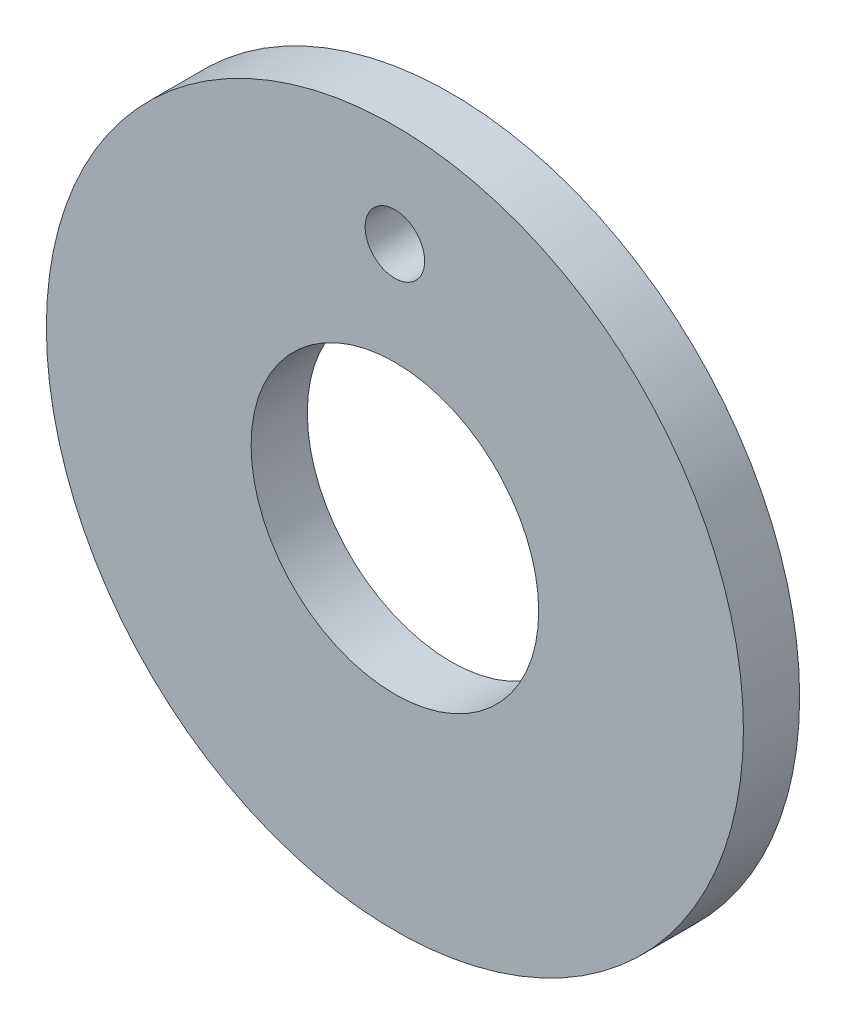
ISO-10303-21;
HEADER;
FILE_DESCRIPTION(('STEP AP214'),'2;1');
FILE_NAME('part.step','',(''),(''),'','','');
FILE_SCHEMA(('AUTOMOTIVE_DESIGN { 1 0 10303 214 1 1 1 1 }'));
ENDSEC;
DATA;
#1=APPLICATION_CONTEXT('core data for automotive mechanical design processes');
#2=APPLICATION_PROTOCOL_DEFINITION('international standard','automotive_design',2000,#1);
#3=PRODUCT_CONTEXT('',#1,'mechanical');
#4=PRODUCT('Part','Part','',(#3));
#5=PRODUCT_RELATED_PRODUCT_CATEGORY('part','',(#4));
#6=PRODUCT_DEFINITION_FORMATION('','',#4);
#7=PRODUCT_DEFINITION_CONTEXT('part definition',#1,'design');
#8=PRODUCT_DEFINITION('design','',#6,#7);
#9=PRODUCT_DEFINITION_SHAPE('','',#8);
#10=(LENGTH_UNIT() NAMED_UNIT(*) SI_UNIT(.MILLI.,.METRE.));
#11=(NAMED_UNIT(*) PLANE_ANGLE_UNIT() SI_UNIT($,.RADIAN.));
#12=(NAMED_UNIT(*) SI_UNIT($,.STERADIAN.) SOLID_ANGLE_UNIT());
#13=UNCERTAINTY_MEASURE_WITH_UNIT(LENGTH_MEASURE(1.E-05),#10,'distance_accuracy_value','');
#14=(GEOMETRIC_REPRESENTATION_CONTEXT(3) GLOBAL_UNCERTAINTY_ASSIGNED_CONTEXT((#13)) GLOBAL_UNIT_ASSIGNED_CONTEXT((#10,
#11,#12)) REPRESENTATION_CONTEXT('',''));
#15=CARTESIAN_POINT('',(0.,0.,0.));
#16=DIRECTION('',(0.,0.,1.));
#17=DIRECTION('',(1.,0.,0.));
#18=AXIS2_PLACEMENT_3D('',#15,#16,#17);
#19=CARTESIAN_POINT('',(0.,0.,6.));
#20=DIRECTION('',(0.,0.,1.));
#21=DIRECTION('',(1.,0.,0.));
#22=AXIS2_PLACEMENT_3D('',#19,#20,#21);
#23=PLANE('',#22);
#24=CARTESIAN_POINT('',(0.,26.275,6.));
#25=DIRECTION('',(0.,0.,1.));
#26=DIRECTION('',(1.,0.,0.));
#27=AXIS2_PLACEMENT_3D('',#24,#25,#26);
#28=CIRCLE('',#27,3.175);
#29=CARTESIAN_POINT('',(3.175,26.275,6.));
#30=VERTEX_POINT('',#29);
#31=EDGE_CURVE('E65',#30,#30,#28,.T.);
#32=ORIENTED_EDGE('',*,*,#31,.F.);
#33=EDGE_LOOP('',(#32));
#34=FACE_BOUND('',#33,.T.);
#35=CARTESIAN_POINT('',(0.,0.,6.));
#36=DIRECTION('',(0.,0.,1.));
#37=DIRECTION('',(1.,0.,0.));
#38=AXIS2_PLACEMENT_3D('',#35,#36,#37);
#39=CIRCLE('',#38,37.2);
#40=CARTESIAN_POINT('',(37.2,0.,6.));
#41=VERTEX_POINT('',#40);
#42=EDGE_CURVE('E10',#41,#41,#39,.T.);
#43=ORIENTED_EDGE('',*,*,#42,.T.);
#44=EDGE_LOOP('',(#43));
#45=FACE_BOUND('',#44,.T.);
#46=CARTESIAN_POINT('',(0.,0.,6.));
#47=DIRECTION('',(0.,0.,1.));
#48=DIRECTION('',(1.,0.,0.));
#49=AXIS2_PLACEMENT_3D('',#46,#47,#48);
#50=CIRCLE('',#49,15.35);
#51=CARTESIAN_POINT('',(15.35,0.,6.));
#52=VERTEX_POINT('',#51);
#53=EDGE_CURVE('E55',#52,#52,#50,.T.);
#54=ORIENTED_EDGE('',*,*,#53,.F.);
#55=EDGE_LOOP('',(#54));
#56=FACE_BOUND('',#55,.T.);
#57=ADVANCED_FACE('F42',(#34,#45,#56),#23,.T.);
#58=CARTESIAN_POINT('',(0.,0.,0.));
#59=DIRECTION('',(0.,0.,1.));
#60=DIRECTION('',(1.,0.,0.));
#61=AXIS2_PLACEMENT_3D('',#58,#59,#60);
#62=PLANE('',#61);
#63=CARTESIAN_POINT('',(0.,26.275,0.));
#64=DIRECTION('',(0.,0.,1.));
#65=DIRECTION('',(1.,0.,0.));
#66=AXIS2_PLACEMENT_3D('',#63,#64,#65);
#67=CIRCLE('',#66,3.175);
#68=CARTESIAN_POINT('',(3.175,26.275,0.));
#69=VERTEX_POINT('',#68);
#70=EDGE_CURVE('E61',#69,#69,#67,.T.);
#71=ORIENTED_EDGE('',*,*,#70,.T.);
#72=EDGE_LOOP('',(#71));
#73=FACE_BOUND('',#72,.T.);
#74=CARTESIAN_POINT('',(0.,0.,0.));
#75=DIRECTION('',(0.,0.,1.));
#76=DIRECTION('',(1.,0.,0.));
#77=AXIS2_PLACEMENT_3D('',#74,#75,#76);
#78=CIRCLE('',#77,37.2);
#79=CARTESIAN_POINT('',(37.2,0.,0.));
#80=VERTEX_POINT('',#79);
#81=EDGE_CURVE('E46',#80,#80,#78,.T.);
#82=ORIENTED_EDGE('',*,*,#81,.F.);
#83=EDGE_LOOP('',(#82));
#84=FACE_BOUND('',#83,.T.);
#85=CARTESIAN_POINT('',(0.,0.,0.));
#86=DIRECTION('',(0.,0.,1.));
#87=DIRECTION('',(1.,0.,0.));
#88=AXIS2_PLACEMENT_3D('',#85,#86,#87);
#89=CIRCLE('',#88,15.35);
#90=CARTESIAN_POINT('',(15.35,0.,0.));
#91=VERTEX_POINT('',#90);
#92=EDGE_CURVE('E57',#91,#91,#89,.T.);
#93=ORIENTED_EDGE('',*,*,#92,.T.);
#94=EDGE_LOOP('',(#93));
#95=FACE_BOUND('',#94,.T.);
#96=ADVANCED_FACE('F73',(#73,#84,#95),#62,.F.);
#97=CARTESIAN_POINT('',(0.,0.,6.));
#98=DIRECTION('',(0.,0.,-1.));
#99=DIRECTION('',(-1.,0.,0.));
#100=AXIS2_PLACEMENT_3D('',#97,#98,#99);
#101=CYLINDRICAL_SURFACE('',#100,37.2);
#102=ORIENTED_EDGE('',*,*,#42,.F.);
#103=EDGE_LOOP('',(#102));
#104=FACE_BOUND('',#103,.T.);
#105=ORIENTED_EDGE('',*,*,#81,.T.);
#106=EDGE_LOOP('',(#105));
#107=FACE_BOUND('',#106,.T.);
#108=ADVANCED_FACE('F44',(#104,#107),#101,.T.);
#109=CARTESIAN_POINT('',(0.,0.,6.));
#110=DIRECTION('',(0.,0.,-1.));
#111=DIRECTION('',(-1.,0.,0.));
#112=AXIS2_PLACEMENT_3D('',#109,#110,#111);
#113=CYLINDRICAL_SURFACE('',#112,15.35);
#114=ORIENTED_EDGE('',*,*,#53,.T.);
#115=EDGE_LOOP('',(#114));
#116=FACE_BOUND('',#115,.T.);
#117=ORIENTED_EDGE('',*,*,#92,.F.);
#118=EDGE_LOOP('',(#117));
#119=FACE_BOUND('',#118,.T.);
#120=ADVANCED_FACE('F79',(#116,#119),#113,.F.);
#121=CARTESIAN_POINT('',(0.,26.275,0.));
#122=DIRECTION('',(0.,0.,1.));
#123=DIRECTION('',(1.,0.,0.));
#124=AXIS2_PLACEMENT_3D('',#121,#122,#123);
#125=CYLINDRICAL_SURFACE('',#124,3.175);
#126=ORIENTED_EDGE('',*,*,#70,.F.);
#127=EDGE_LOOP('',(#126));
#128=FACE_BOUND('',#127,.T.);
#129=ORIENTED_EDGE('',*,*,#31,.T.);
#130=EDGE_LOOP('',(#129));
#131=FACE_BOUND('',#130,.T.);
#132=ADVANCED_FACE('F76',(#128,#131),#125,.F.);
#133=CLOSED_SHELL('',(#57,#96,#108,#120,#132));
#134=MANIFOLD_SOLID_BREP('B2',#133);
#135=ADVANCED_BREP_SHAPE_REPRESENTATION('',(#18,#134),#14);
#136=SHAPE_DEFINITION_REPRESENTATION(#9,#135);
ENDSEC;
END-ISO-10303-21;
